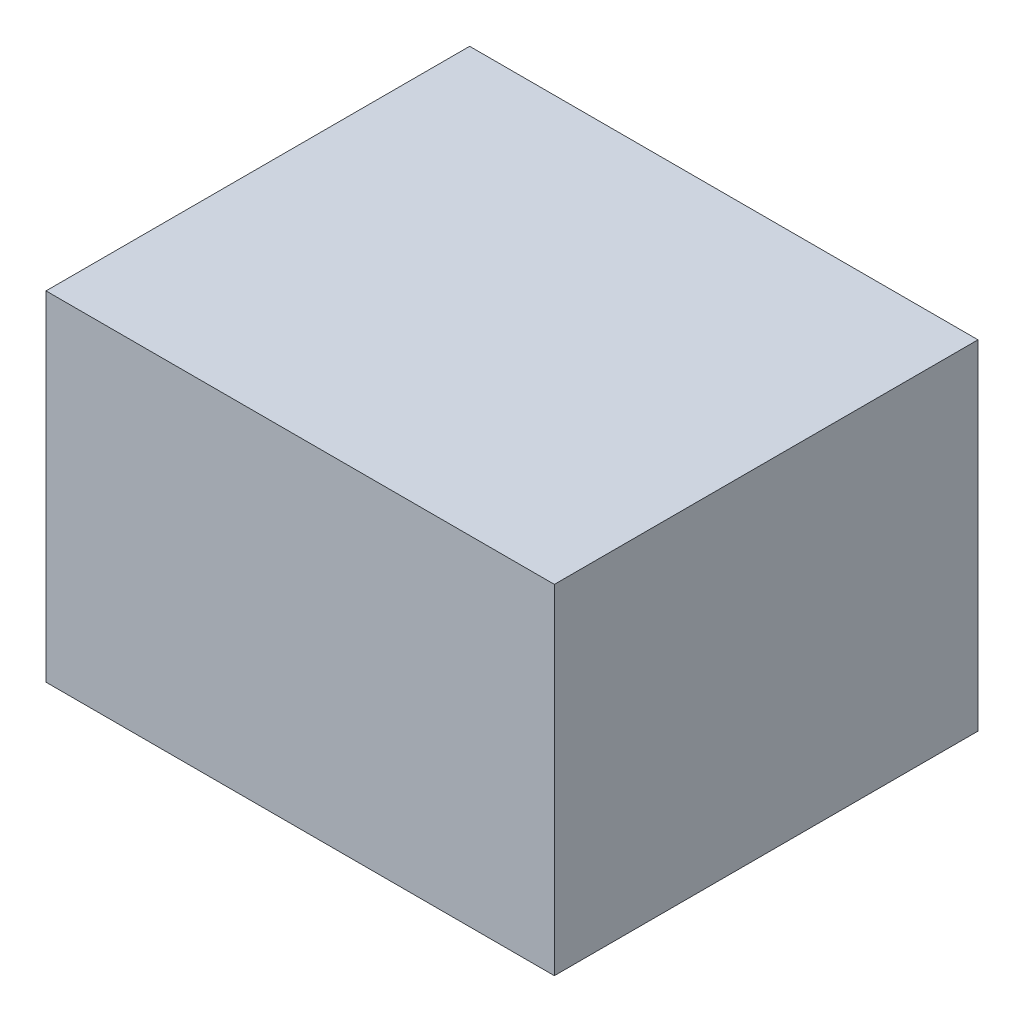
ISO-10303-21;
HEADER;
FILE_DESCRIPTION(('STEP AP214'),'2;1');
FILE_NAME('part.step','',(''),(''),'','','');
FILE_SCHEMA(('AUTOMOTIVE_DESIGN { 1 0 10303 214 1 1 1 1 }'));
ENDSEC;
DATA;
#1=APPLICATION_CONTEXT('core data for automotive mechanical design processes');
#2=APPLICATION_PROTOCOL_DEFINITION('international standard','automotive_design',2000,#1);
#3=PRODUCT_CONTEXT('',#1,'mechanical');
#4=PRODUCT('Part','Part','',(#3));
#5=PRODUCT_RELATED_PRODUCT_CATEGORY('part','',(#4));
#6=PRODUCT_DEFINITION_FORMATION('','',#4);
#7=PRODUCT_DEFINITION_CONTEXT('part definition',#1,'design');
#8=PRODUCT_DEFINITION('design','',#6,#7);
#9=PRODUCT_DEFINITION_SHAPE('','',#8);
#10=(LENGTH_UNIT() NAMED_UNIT(*) SI_UNIT(.MILLI.,.METRE.));
#11=(NAMED_UNIT(*) PLANE_ANGLE_UNIT() SI_UNIT($,.RADIAN.));
#12=(NAMED_UNIT(*) SI_UNIT($,.STERADIAN.) SOLID_ANGLE_UNIT());
#13=UNCERTAINTY_MEASURE_WITH_UNIT(LENGTH_MEASURE(1.E-05),#10,'distance_accuracy_value','');
#14=(GEOMETRIC_REPRESENTATION_CONTEXT(3) GLOBAL_UNCERTAINTY_ASSIGNED_CONTEXT((#13)) GLOBAL_UNIT_ASSIGNED_CONTEXT((#10,
#11,#12)) REPRESENTATION_CONTEXT('',''));
#15=CARTESIAN_POINT('',(0.,0.,0.));
#16=DIRECTION('',(0.,0.,1.));
#17=DIRECTION('',(1.,0.,0.));
#18=AXIS2_PLACEMENT_3D('',#15,#16,#17);
#19=CARTESIAN_POINT('',(60.,80.,-50.));
#20=DIRECTION('',(-1.,0.,0.));
#21=DIRECTION('',(0.,0.,1.));
#22=AXIS2_PLACEMENT_3D('',#19,#20,#21);
#23=PLANE('',#22);
#24=DIRECTION('',(0.,0.,-1.));
#25=VECTOR('',#24,1.);
#26=CARTESIAN_POINT('',(60.,0.,-50.));
#27=LINE('',#26,#25);
#28=CARTESIAN_POINT('',(60.,0.,50.));
#29=VERTEX_POINT('',#28);
#30=CARTESIAN_POINT('',(60.,0.,-50.));
#31=VERTEX_POINT('',#30);
#32=EDGE_CURVE('E107',#29,#31,#27,.T.);
#33=ORIENTED_EDGE('',*,*,#32,.T.);
#34=DIRECTION('',(0.,-1.,0.));
#35=VECTOR('',#34,1.);
#36=CARTESIAN_POINT('',(60.,80.,-50.));
#37=LINE('',#36,#35);
#38=CARTESIAN_POINT('',(60.,80.,-50.));
#39=VERTEX_POINT('',#38);
#40=EDGE_CURVE('E11',#39,#31,#37,.T.);
#41=ORIENTED_EDGE('',*,*,#40,.F.);
#42=DIRECTION('',(0.,0.,-1.));
#43=VECTOR('',#42,1.);
#44=CARTESIAN_POINT('',(60.,80.,-50.));
#45=LINE('',#44,#43);
#46=CARTESIAN_POINT('',(60.,80.,50.));
#47=VERTEX_POINT('',#46);
#48=EDGE_CURVE('E91',#47,#39,#45,.T.);
#49=ORIENTED_EDGE('',*,*,#48,.F.);
#50=DIRECTION('',(0.,-1.,0.));
#51=VECTOR('',#50,1.);
#52=CARTESIAN_POINT('',(60.,80.,50.));
#53=LINE('',#52,#51);
#54=EDGE_CURVE('E103',#47,#29,#53,.T.);
#55=ORIENTED_EDGE('',*,*,#54,.T.);
#56=EDGE_LOOP('',(#33,#41,#49,#55));
#57=FACE_BOUND('',#56,.T.);
#58=ADVANCED_FACE('F39',(#57),#23,.F.);
#59=CARTESIAN_POINT('',(-60.,80.,-50.));
#60=DIRECTION('',(0.,0.,1.));
#61=DIRECTION('',(1.,0.,0.));
#62=AXIS2_PLACEMENT_3D('',#59,#60,#61);
#63=PLANE('',#62);
#64=DIRECTION('',(-1.,0.,0.));
#65=VECTOR('',#64,1.);
#66=CARTESIAN_POINT('',(-60.,0.,-50.));
#67=LINE('',#66,#65);
#68=CARTESIAN_POINT('',(-60.,0.,-50.));
#69=VERTEX_POINT('',#68);
#70=EDGE_CURVE('E96',#31,#69,#67,.T.);
#71=ORIENTED_EDGE('',*,*,#70,.T.);
#72=DIRECTION('',(0.,-1.,0.));
#73=VECTOR('',#72,1.);
#74=CARTESIAN_POINT('',(-60.,80.,-50.));
#75=LINE('',#74,#73);
#76=CARTESIAN_POINT('',(-60.,80.,-50.));
#77=VERTEX_POINT('',#76);
#78=EDGE_CURVE('E48',#77,#69,#75,.T.);
#79=ORIENTED_EDGE('',*,*,#78,.F.);
#80=DIRECTION('',(-1.,0.,0.));
#81=VECTOR('',#80,1.);
#82=CARTESIAN_POINT('',(-60.,80.,-50.));
#83=LINE('',#82,#81);
#84=EDGE_CURVE('E86',#39,#77,#83,.T.);
#85=ORIENTED_EDGE('',*,*,#84,.F.);
#86=ORIENTED_EDGE('',*,*,#40,.T.);
#87=EDGE_LOOP('',(#71,#79,#85,#86));
#88=FACE_BOUND('',#87,.T.);
#89=ADVANCED_FACE('F95',(#88),#63,.F.);
#90=CARTESIAN_POINT('',(-60.,80.,-50.));
#91=DIRECTION('',(1.,0.,0.));
#92=DIRECTION('',(0.,0.,-1.));
#93=AXIS2_PLACEMENT_3D('',#90,#91,#92);
#94=PLANE('',#93);
#95=DIRECTION('',(0.,0.,1.));
#96=VECTOR('',#95,1.);
#97=CARTESIAN_POINT('',(-60.,0.,-50.));
#98=LINE('',#97,#96);
#99=CARTESIAN_POINT('',(-60.,0.,50.));
#100=VERTEX_POINT('',#99);
#101=EDGE_CURVE('E73',#69,#100,#98,.T.);
#102=ORIENTED_EDGE('',*,*,#101,.T.);
#103=DIRECTION('',(0.,-1.,0.));
#104=VECTOR('',#103,1.);
#105=CARTESIAN_POINT('',(-60.,80.,50.));
#106=LINE('',#105,#104);
#107=CARTESIAN_POINT('',(-60.,80.,50.));
#108=VERTEX_POINT('',#107);
#109=EDGE_CURVE('E98',#108,#100,#106,.T.);
#110=ORIENTED_EDGE('',*,*,#109,.F.);
#111=DIRECTION('',(0.,0.,1.));
#112=VECTOR('',#111,1.);
#113=CARTESIAN_POINT('',(-60.,80.,-50.));
#114=LINE('',#113,#112);
#115=EDGE_CURVE('E89',#77,#108,#114,.T.);
#116=ORIENTED_EDGE('',*,*,#115,.F.);
#117=ORIENTED_EDGE('',*,*,#78,.T.);
#118=EDGE_LOOP('',(#102,#110,#116,#117));
#119=FACE_BOUND('',#118,.T.);
#120=ADVANCED_FACE('F99',(#119),#94,.F.);
#121=CARTESIAN_POINT('',(-60.,80.,50.));
#122=DIRECTION('',(0.,0.,-1.));
#123=DIRECTION('',(-1.,0.,0.));
#124=AXIS2_PLACEMENT_3D('',#121,#122,#123);
#125=PLANE('',#124);
#126=DIRECTION('',(1.,0.,0.));
#127=VECTOR('',#126,1.);
#128=CARTESIAN_POINT('',(-60.,0.,50.));
#129=LINE('',#128,#127);
#130=EDGE_CURVE('E79',#100,#29,#129,.T.);
#131=ORIENTED_EDGE('',*,*,#130,.T.);
#132=ORIENTED_EDGE('',*,*,#54,.F.);
#133=DIRECTION('',(1.,0.,0.));
#134=VECTOR('',#133,1.);
#135=CARTESIAN_POINT('',(-60.,80.,50.));
#136=LINE('',#135,#134);
#137=EDGE_CURVE('E56',#108,#47,#136,.T.);
#138=ORIENTED_EDGE('',*,*,#137,.F.);
#139=ORIENTED_EDGE('',*,*,#109,.T.);
#140=EDGE_LOOP('',(#131,#132,#138,#139));
#141=FACE_BOUND('',#140,.T.);
#142=ADVANCED_FACE('F120',(#141),#125,.F.);
#143=CARTESIAN_POINT('',(0.,80.,0.));
#144=DIRECTION('',(0.,1.,0.));
#145=DIRECTION('',(0.,0.,1.));
#146=AXIS2_PLACEMENT_3D('',#143,#144,#145);
#147=PLANE('',#146);
#148=ORIENTED_EDGE('',*,*,#48,.T.);
#149=ORIENTED_EDGE('',*,*,#84,.T.);
#150=ORIENTED_EDGE('',*,*,#115,.T.);
#151=ORIENTED_EDGE('',*,*,#137,.T.);
#152=EDGE_LOOP('',(#148,#149,#150,#151));
#153=FACE_BOUND('',#152,.T.);
#154=ADVANCED_FACE('F87',(#153),#147,.T.);
#155=CARTESIAN_POINT('',(0.,0.,0.));
#156=DIRECTION('',(0.,1.,0.));
#157=DIRECTION('',(0.,0.,1.));
#158=AXIS2_PLACEMENT_3D('',#155,#156,#157);
#159=PLANE('',#158);
#160=ORIENTED_EDGE('',*,*,#32,.F.);
#161=ORIENTED_EDGE('',*,*,#130,.F.);
#162=ORIENTED_EDGE('',*,*,#101,.F.);
#163=ORIENTED_EDGE('',*,*,#70,.F.);
#164=EDGE_LOOP('',(#160,#161,#162,#163));
#165=FACE_BOUND('',#164,.T.);
#166=ADVANCED_FACE('F123',(#165),#159,.F.);
#167=CLOSED_SHELL('',(#58,#89,#120,#142,#154,#166));
#168=MANIFOLD_SOLID_BREP('B2',#167);
#169=ADVANCED_BREP_SHAPE_REPRESENTATION('',(#18,#168),#14);
#170=SHAPE_DEFINITION_REPRESENTATION(#9,#169);
ENDSEC;
END-ISO-10303-21;
